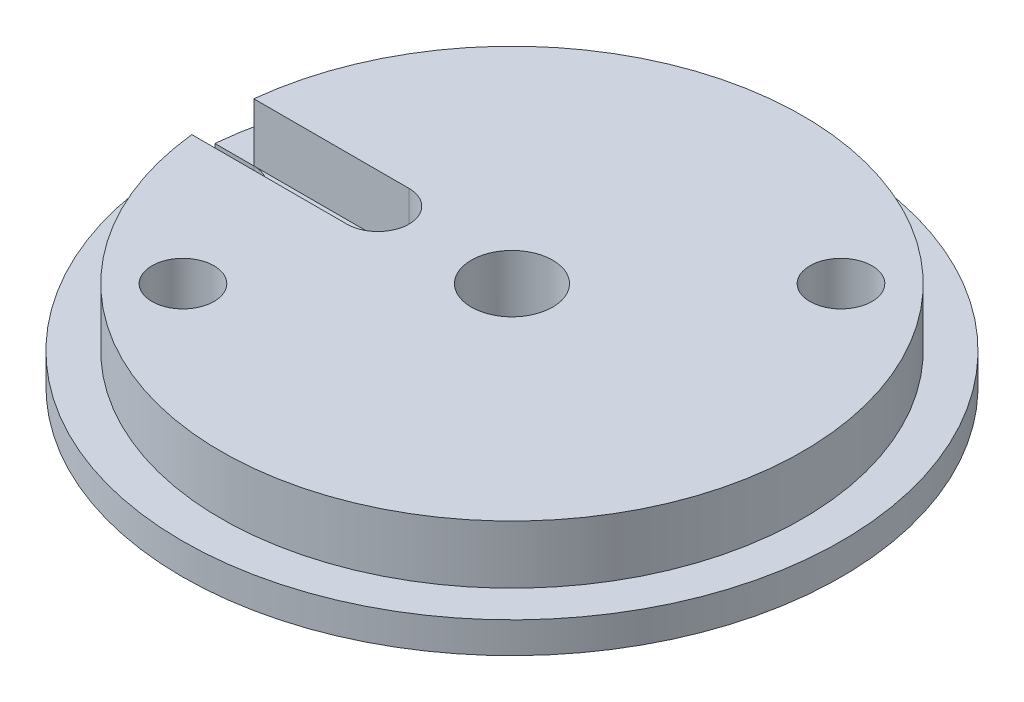
ISO-10303-21;
HEADER;
FILE_DESCRIPTION(('STEP AP214'),'2;1');
FILE_NAME('part.step','',(''),(''),'','','');
FILE_SCHEMA(('AUTOMOTIVE_DESIGN { 1 0 10303 214 1 1 1 1 }'));
ENDSEC;
DATA;
#1=APPLICATION_CONTEXT('core data for automotive mechanical design processes');
#2=APPLICATION_PROTOCOL_DEFINITION('international standard','automotive_design',2000,#1);
#3=PRODUCT_CONTEXT('',#1,'mechanical');
#4=PRODUCT('Part','Part','',(#3));
#5=PRODUCT_RELATED_PRODUCT_CATEGORY('part','',(#4));
#6=PRODUCT_DEFINITION_FORMATION('','',#4);
#7=PRODUCT_DEFINITION_CONTEXT('part definition',#1,'design');
#8=PRODUCT_DEFINITION('design','',#6,#7);
#9=PRODUCT_DEFINITION_SHAPE('','',#8);
#10=(LENGTH_UNIT() NAMED_UNIT(*) SI_UNIT(.MILLI.,.METRE.));
#11=(NAMED_UNIT(*) PLANE_ANGLE_UNIT() SI_UNIT($,.RADIAN.));
#12=(NAMED_UNIT(*) SI_UNIT($,.STERADIAN.) SOLID_ANGLE_UNIT());
#13=UNCERTAINTY_MEASURE_WITH_UNIT(LENGTH_MEASURE(1.E-05),#10,'distance_accuracy_value','');
#14=(GEOMETRIC_REPRESENTATION_CONTEXT(3) GLOBAL_UNCERTAINTY_ASSIGNED_CONTEXT((#13)) GLOBAL_UNIT_ASSIGNED_CONTEXT((#10,
#11,#12)) REPRESENTATION_CONTEXT('',''));
#15=CARTESIAN_POINT('',(0.,0.,0.));
#16=DIRECTION('',(0.,0.,1.));
#17=DIRECTION('',(1.,0.,0.));
#18=AXIS2_PLACEMENT_3D('',#15,#16,#17);
#19=CARTESIAN_POINT('',(0.,3.,0.));
#20=DIRECTION('',(0.,1.,0.));
#21=DIRECTION('',(0.,0.,-1.));
#22=AXIS2_PLACEMENT_3D('',#19,#20,#21);
#23=PLANE('',#22);
#24=CARTESIAN_POINT('',(-8.48528137423855,3.,8.48528137423859));
#25=DIRECTION('',(0.,1.,0.));
#26=DIRECTION('',(0.,0.,1.));
#27=AXIS2_PLACEMENT_3D('',#24,#25,#26);
#28=CIRCLE('',#27,1.6);
#29=CARTESIAN_POINT('',(-8.48528137423855,3.,10.0852813742386));
#30=VERTEX_POINT('',#29);
#31=EDGE_CURVE('E217',#30,#30,#28,.T.);
#32=ORIENTED_EDGE('',*,*,#31,.F.);
#33=EDGE_LOOP('',(#32));
#34=FACE_BOUND('',#33,.T.);
#35=CARTESIAN_POINT('',(8.48528137423856,3.,-8.48528137423859));
#36=DIRECTION('',(0.,1.,0.));
#37=DIRECTION('',(0.,0.,-1.));
#38=AXIS2_PLACEMENT_3D('',#35,#36,#37);
#39=CIRCLE('',#38,1.6);
#40=CARTESIAN_POINT('',(8.48528137423856,3.,-10.0852813742386));
#41=VERTEX_POINT('',#40);
#42=EDGE_CURVE('E345',#41,#41,#39,.T.);
#43=ORIENTED_EDGE('',*,*,#42,.F.);
#44=EDGE_LOOP('',(#43));
#45=FACE_BOUND('',#44,.T.);
#46=DIRECTION('',(-1.,0.,0.));
#47=VECTOR('',#46,1.);
#48=CARTESIAN_POINT('',(-14.9144225500017,3.,1.6));
#49=LINE('',#48,#47);
#50=CARTESIAN_POINT('',(-6.91442255000173,3.,1.6));
#51=VERTEX_POINT('',#50);
#52=CARTESIAN_POINT('',(-14.9144225500017,3.,1.6));
#53=VERTEX_POINT('',#52);
#54=EDGE_CURVE('E143',#51,#53,#49,.T.);
#55=ORIENTED_EDGE('',*,*,#54,.T.);
#56=CARTESIAN_POINT('',(0.,3.,0.));
#57=DIRECTION('',(0.,-1.,0.));
#58=DIRECTION('',(0.,0.,-1.));
#59=AXIS2_PLACEMENT_3D('',#56,#57,#58);
#60=CIRCLE('',#59,15.);
#61=CARTESIAN_POINT('',(-14.9144225500017,3.,-1.6));
#62=VERTEX_POINT('',#61);
#63=EDGE_CURVE('E159',#62,#53,#60,.T.);
#64=ORIENTED_EDGE('',*,*,#63,.F.);
#65=DIRECTION('',(1.,0.,0.));
#66=VECTOR('',#65,1.);
#67=CARTESIAN_POINT('',(-14.9144225500017,3.,-1.6));
#68=LINE('',#67,#66);
#69=CARTESIAN_POINT('',(-6.91442255000173,3.,-1.6));
#70=VERTEX_POINT('',#69);
#71=EDGE_CURVE('E104',#62,#70,#68,.T.);
#72=ORIENTED_EDGE('',*,*,#71,.T.);
#73=CARTESIAN_POINT('',(-6.91442255000173,3.,0.));
#74=DIRECTION('',(0.,-1.,0.));
#75=DIRECTION('',(0.,0.,1.));
#76=AXIS2_PLACEMENT_3D('',#73,#74,#75);
#77=CIRCLE('',#76,1.6);
#78=EDGE_CURVE('E140',#70,#51,#77,.T.);
#79=ORIENTED_EDGE('',*,*,#78,.T.);
#80=EDGE_LOOP('',(#55,#64,#72,#79));
#81=FACE_BOUND('',#80,.T.);
#82=CARTESIAN_POINT('',(0.,3.,0.));
#83=DIRECTION('',(0.,-1.,0.));
#84=DIRECTION('',(0.,0.,-1.));
#85=AXIS2_PLACEMENT_3D('',#82,#83,#84);
#86=CIRCLE('',#85,2.1);
#87=CARTESIAN_POINT('',(0.,3.,-2.1));
#88=VERTEX_POINT('',#87);
#89=EDGE_CURVE('E155',#88,#88,#86,.T.);
#90=ORIENTED_EDGE('',*,*,#89,.T.);
#91=EDGE_LOOP('',(#90));
#92=FACE_BOUND('',#91,.T.);
#93=ADVANCED_FACE('F37',(#34,#45,#81,#92),#23,.T.);
#94=CARTESIAN_POINT('',(0.,3.,0.));
#95=DIRECTION('',(0.,-1.,0.));
#96=DIRECTION('',(0.,0.,1.));
#97=AXIS2_PLACEMENT_3D('',#94,#95,#96);
#98=CYLINDRICAL_SURFACE('',#97,15.);
#99=CARTESIAN_POINT('',(0.,0.,0.));
#100=DIRECTION('',(0.,-1.,0.));
#101=DIRECTION('',(0.,0.,-1.));
#102=AXIS2_PLACEMENT_3D('',#99,#100,#101);
#103=CIRCLE('',#102,15.);
#104=CARTESIAN_POINT('',(-14.9144225500017,0.,-1.6));
#105=VERTEX_POINT('',#104);
#106=CARTESIAN_POINT('',(-14.9144225500017,0.,1.6));
#107=VERTEX_POINT('',#106);
#108=EDGE_CURVE('E158',#105,#107,#103,.T.);
#109=ORIENTED_EDGE('',*,*,#108,.F.);
#110=DIRECTION('',(0.,-1.,0.));
#111=VECTOR('',#110,1.);
#112=CARTESIAN_POINT('',(-14.9144225500017,3.,-1.6));
#113=LINE('',#112,#111);
#114=EDGE_CURVE('E45',#62,#105,#113,.T.);
#115=ORIENTED_EDGE('',*,*,#114,.F.);
#116=ORIENTED_EDGE('',*,*,#63,.T.);
#117=DIRECTION('',(0.,-1.,0.));
#118=VECTOR('',#117,1.);
#119=CARTESIAN_POINT('',(-14.9144225500017,3.,1.6));
#120=LINE('',#119,#118);
#121=EDGE_CURVE('E11',#107,#53,#120,.F.);
#122=ORIENTED_EDGE('',*,*,#121,.F.);
#123=EDGE_LOOP('',(#109,#115,#116,#122));
#124=FACE_BOUND('',#123,.T.);
#125=ADVANCED_FACE('F39',(#124),#98,.T.);
#126=CARTESIAN_POINT('',(0.,3.,0.));
#127=DIRECTION('',(0.,-1.,0.));
#128=DIRECTION('',(0.,0.,1.));
#129=AXIS2_PLACEMENT_3D('',#126,#127,#128);
#130=CYLINDRICAL_SURFACE('',#129,2.1);
#131=ORIENTED_EDGE('',*,*,#89,.F.);
#132=EDGE_LOOP('',(#131));
#133=FACE_BOUND('',#132,.T.);
#134=CARTESIAN_POINT('',(0.,-1.6,0.));
#135=DIRECTION('',(0.,1.,0.));
#136=DIRECTION('',(0.,0.,1.));
#137=AXIS2_PLACEMENT_3D('',#134,#135,#136);
#138=CIRCLE('',#137,2.1);
#139=CARTESIAN_POINT('',(0.,-1.6,2.1));
#140=VERTEX_POINT('',#139);
#141=EDGE_CURVE('E182',#140,#140,#138,.T.);
#142=ORIENTED_EDGE('',*,*,#141,.F.);
#143=EDGE_LOOP('',(#142));
#144=FACE_BOUND('',#143,.T.);
#145=ADVANCED_FACE('F198',(#133,#144),#130,.F.);
#146=CARTESIAN_POINT('',(-6.91442255000173,-7.,0.));
#147=DIRECTION('',(0.,1.,0.));
#148=DIRECTION('',(0.,0.,-1.));
#149=AXIS2_PLACEMENT_3D('',#146,#147,#148);
#150=CYLINDRICAL_SURFACE('',#149,1.6);
#151=DIRECTION('',(0.,1.,0.));
#152=VECTOR('',#151,1.);
#153=CARTESIAN_POINT('',(-6.91442255000173,-7.,-1.6));
#154=LINE('',#153,#152);
#155=CARTESIAN_POINT('',(-6.91442255000173,0.,-1.6));
#156=VERTEX_POINT('',#155);
#157=EDGE_CURVE('E146',#156,#70,#154,.T.);
#158=ORIENTED_EDGE('',*,*,#157,.F.);
#159=CARTESIAN_POINT('',(-6.91442255000173,0.,0.));
#160=DIRECTION('',(0.,1.,0.));
#161=DIRECTION('',(0.,0.,1.));
#162=AXIS2_PLACEMENT_3D('',#159,#160,#161);
#163=CIRCLE('',#162,1.6);
#164=CARTESIAN_POINT('',(-6.91442255000173,0.,1.6));
#165=VERTEX_POINT('',#164);
#166=EDGE_CURVE('E123',#156,#165,#163,.T.);
#167=ORIENTED_EDGE('',*,*,#166,.T.);
#168=DIRECTION('',(0.,1.,0.));
#169=VECTOR('',#168,1.);
#170=CARTESIAN_POINT('',(-6.91442255000173,-7.,1.6));
#171=LINE('',#170,#169);
#172=EDGE_CURVE('E147',#165,#51,#171,.T.);
#173=ORIENTED_EDGE('',*,*,#172,.T.);
#174=ORIENTED_EDGE('',*,*,#78,.F.);
#175=EDGE_LOOP('',(#158,#167,#173,#174));
#176=FACE_BOUND('',#175,.T.);
#177=CARTESIAN_POINT('',(-6.91442255000173,-1.6,0.));
#178=DIRECTION('',(0.,1.,0.));
#179=DIRECTION('',(0.,0.,1.));
#180=AXIS2_PLACEMENT_3D('',#177,#178,#179);
#181=CIRCLE('',#180,1.6);
#182=CARTESIAN_POINT('',(-6.91442255000173,-1.6,1.6));
#183=VERTEX_POINT('',#182);
#184=EDGE_CURVE('E131',#183,#183,#181,.T.);
#185=ORIENTED_EDGE('',*,*,#184,.F.);
#186=EDGE_LOOP('',(#185));
#187=FACE_BOUND('',#186,.T.);
#188=ADVANCED_FACE('F184',(#176,#187),#150,.F.);
#189=CARTESIAN_POINT('',(-14.9144225500017,-7.,1.6));
#190=DIRECTION('',(0.,0.,1.));
#191=DIRECTION('',(-1.,0.,0.));
#192=AXIS2_PLACEMENT_3D('',#189,#190,#191);
#193=PLANE('',#192);
#194=ORIENTED_EDGE('',*,*,#172,.F.);
#195=DIRECTION('',(-1.,0.,0.));
#196=VECTOR('',#195,1.);
#197=CARTESIAN_POINT('',(0.,0.,1.6));
#198=LINE('',#197,#196);
#199=EDGE_CURVE('E152',#165,#107,#198,.T.);
#200=ORIENTED_EDGE('',*,*,#199,.T.);
#201=ORIENTED_EDGE('',*,*,#121,.T.);
#202=ORIENTED_EDGE('',*,*,#54,.F.);
#203=EDGE_LOOP('',(#194,#200,#201,#202));
#204=FACE_BOUND('',#203,.T.);
#205=ADVANCED_FACE('F190',(#204),#193,.F.);
#206=CARTESIAN_POINT('',(-14.9144225500017,-7.,-1.6));
#207=DIRECTION('',(0.,0.,-1.));
#208=DIRECTION('',(1.,0.,0.));
#209=AXIS2_PLACEMENT_3D('',#206,#207,#208);
#210=PLANE('',#209);
#211=ORIENTED_EDGE('',*,*,#114,.T.);
#212=DIRECTION('',(1.,0.,0.));
#213=VECTOR('',#212,1.);
#214=CARTESIAN_POINT('',(0.,0.,-1.6));
#215=LINE('',#214,#213);
#216=EDGE_CURVE('E149',#105,#156,#215,.T.);
#217=ORIENTED_EDGE('',*,*,#216,.T.);
#218=ORIENTED_EDGE('',*,*,#157,.T.);
#219=ORIENTED_EDGE('',*,*,#71,.F.);
#220=EDGE_LOOP('',(#211,#217,#218,#219));
#221=FACE_BOUND('',#220,.T.);
#222=ADVANCED_FACE('F167',(#221),#210,.F.);
#223=CARTESIAN_POINT('',(0.,0.,0.));
#224=DIRECTION('',(0.,-1.,0.));
#225=DIRECTION('',(0.,0.,1.));
#226=AXIS2_PLACEMENT_3D('',#223,#224,#225);
#227=PLANE('',#226);
#228=ORIENTED_EDGE('',*,*,#166,.F.);
#229=ORIENTED_EDGE('',*,*,#216,.F.);
#230=CARTESIAN_POINT('',(-14.9144225500017,0.,0.));
#231=DIRECTION('',(0.,-1.,0.));
#232=DIRECTION('',(0.,0.,-1.));
#233=AXIS2_PLACEMENT_3D('',#230,#231,#232);
#234=CIRCLE('',#233,1.6);
#235=EDGE_CURVE('E120',#105,#107,#234,.T.);
#236=ORIENTED_EDGE('',*,*,#235,.T.);
#237=ORIENTED_EDGE('',*,*,#199,.F.);
#238=EDGE_LOOP('',(#228,#229,#236,#237));
#239=FACE_BOUND('',#238,.T.);
#240=ADVANCED_FACE('F177',(#239),#227,.F.);
#241=CARTESIAN_POINT('',(0.,-1.6,0.));
#242=DIRECTION('',(0.,-1.,0.));
#243=DIRECTION('',(0.,0.,1.));
#244=AXIS2_PLACEMENT_3D('',#241,#242,#243);
#245=PLANE('',#244);
#246=CARTESIAN_POINT('',(-8.48528137423855,-1.6,8.48528137423859));
#247=DIRECTION('',(0.,1.,0.));
#248=DIRECTION('',(0.,0.,1.));
#249=AXIS2_PLACEMENT_3D('',#246,#247,#248);
#250=CIRCLE('',#249,1.6);
#251=CARTESIAN_POINT('',(-8.48528137423855,-1.6,10.0852813742386));
#252=VERTEX_POINT('',#251);
#253=EDGE_CURVE('E220',#252,#252,#250,.T.);
#254=ORIENTED_EDGE('',*,*,#253,.T.);
#255=EDGE_LOOP('',(#254));
#256=FACE_BOUND('',#255,.T.);
#257=CARTESIAN_POINT('',(8.48528137423856,-1.6,-8.48528137423859));
#258=DIRECTION('',(0.,1.,0.));
#259=DIRECTION('',(0.,0.,-1.));
#260=AXIS2_PLACEMENT_3D('',#257,#258,#259);
#261=CIRCLE('',#260,1.6);
#262=CARTESIAN_POINT('',(8.48528137423856,-1.6,-10.0852813742386));
#263=VERTEX_POINT('',#262);
#264=EDGE_CURVE('E223',#263,#263,#261,.T.);
#265=ORIENTED_EDGE('',*,*,#264,.T.);
#266=EDGE_LOOP('',(#265));
#267=FACE_BOUND('',#266,.T.);
#268=ORIENTED_EDGE('',*,*,#184,.T.);
#269=EDGE_LOOP('',(#268));
#270=FACE_BOUND('',#269,.T.);
#271=CARTESIAN_POINT('',(0.,-1.6,0.));
#272=DIRECTION('',(0.,1.,0.));
#273=DIRECTION('',(0.,0.,1.));
#274=AXIS2_PLACEMENT_3D('',#271,#272,#273);
#275=CIRCLE('',#274,17.);
#276=CARTESIAN_POINT('',(-16.924538398432,-1.6,1.6));
#277=VERTEX_POINT('',#276);
#278=CARTESIAN_POINT('',(-16.924538398432,-1.6,-1.6));
#279=VERTEX_POINT('',#278);
#280=EDGE_CURVE('E111',#277,#279,#275,.T.);
#281=ORIENTED_EDGE('',*,*,#280,.F.);
#282=DIRECTION('',(-1.,0.,0.));
#283=VECTOR('',#282,1.);
#284=CARTESIAN_POINT('',(-16.924538398432,-1.6,1.6));
#285=LINE('',#284,#283);
#286=CARTESIAN_POINT('',(-14.9144225500017,-1.6,1.6));
#287=VERTEX_POINT('',#286);
#288=EDGE_CURVE('E127',#287,#277,#285,.T.);
#289=ORIENTED_EDGE('',*,*,#288,.F.);
#290=CARTESIAN_POINT('',(-14.9144225500017,-1.6,0.));
#291=DIRECTION('',(0.,-1.,0.));
#292=DIRECTION('',(0.,0.,-1.));
#293=AXIS2_PLACEMENT_3D('',#290,#291,#292);
#294=CIRCLE('',#293,1.6);
#295=CARTESIAN_POINT('',(-14.9144225500017,-1.6,-1.6));
#296=VERTEX_POINT('',#295);
#297=EDGE_CURVE('E112',#296,#287,#294,.T.);
#298=ORIENTED_EDGE('',*,*,#297,.F.);
#299=DIRECTION('',(1.,0.,0.));
#300=VECTOR('',#299,1.);
#301=CARTESIAN_POINT('',(-14.9144225500017,-1.6,-1.6));
#302=LINE('',#301,#300);
#303=EDGE_CURVE('E97',#279,#296,#302,.T.);
#304=ORIENTED_EDGE('',*,*,#303,.F.);
#305=EDGE_LOOP('',(#281,#289,#298,#304));
#306=FACE_BOUND('',#305,.T.);
#307=ORIENTED_EDGE('',*,*,#141,.T.);
#308=EDGE_LOOP('',(#307));
#309=FACE_BOUND('',#308,.T.);
#310=ADVANCED_FACE('F108',(#256,#267,#270,#306,#309),#245,.T.);
#311=ORIENTED_EDGE('',*,*,#108,.T.);
#312=DIRECTION('',(-1.,0.,0.));
#313=VECTOR('',#312,1.);
#314=CARTESIAN_POINT('',(-16.924538398432,0.,1.6));
#315=LINE('',#314,#313);
#316=CARTESIAN_POINT('',(-16.924538398432,0.,1.6));
#317=VERTEX_POINT('',#316);
#318=EDGE_CURVE('E117',#107,#317,#315,.T.);
#319=ORIENTED_EDGE('',*,*,#318,.T.);
#320=CARTESIAN_POINT('',(0.,0.,0.));
#321=DIRECTION('',(0.,1.,0.));
#322=DIRECTION('',(0.,0.,1.));
#323=AXIS2_PLACEMENT_3D('',#320,#321,#322);
#324=CIRCLE('',#323,17.);
#325=CARTESIAN_POINT('',(-16.924538398432,0.,-1.6));
#326=VERTEX_POINT('',#325);
#327=EDGE_CURVE('E129',#317,#326,#324,.T.);
#328=ORIENTED_EDGE('',*,*,#327,.T.);
#329=DIRECTION('',(1.,0.,0.));
#330=VECTOR('',#329,1.);
#331=CARTESIAN_POINT('',(-14.9144225500017,0.,-1.6));
#332=LINE('',#331,#330);
#333=EDGE_CURVE('E99',#326,#105,#332,.T.);
#334=ORIENTED_EDGE('',*,*,#333,.T.);
#335=EDGE_LOOP('',(#311,#319,#328,#334));
#336=FACE_BOUND('',#335,.T.);
#337=ADVANCED_FACE('F174',(#336),#227,.F.);
#338=CARTESIAN_POINT('',(0.,-1.6,0.));
#339=DIRECTION('',(0.,1.,0.));
#340=DIRECTION('',(0.,0.,-1.));
#341=AXIS2_PLACEMENT_3D('',#338,#339,#340);
#342=CYLINDRICAL_SURFACE('',#341,17.);
#343=ORIENTED_EDGE('',*,*,#327,.F.);
#344=DIRECTION('',(0.,1.,0.));
#345=VECTOR('',#344,1.);
#346=CARTESIAN_POINT('',(-16.924538398432,-1.6,1.6));
#347=LINE('',#346,#345);
#348=EDGE_CURVE('E115',#277,#317,#347,.T.);
#349=ORIENTED_EDGE('',*,*,#348,.F.);
#350=ORIENTED_EDGE('',*,*,#280,.T.);
#351=DIRECTION('',(0.,1.,0.));
#352=VECTOR('',#351,1.);
#353=CARTESIAN_POINT('',(-16.924538398432,-1.6,-1.6));
#354=LINE('',#353,#352);
#355=EDGE_CURVE('E94',#279,#326,#354,.T.);
#356=ORIENTED_EDGE('',*,*,#355,.T.);
#357=EDGE_LOOP('',(#343,#349,#350,#356));
#358=FACE_BOUND('',#357,.T.);
#359=ADVANCED_FACE('F114',(#358),#342,.T.);
#360=CARTESIAN_POINT('',(-14.9144225500017,-1.6,-1.6));
#361=DIRECTION('',(0.,0.,-1.));
#362=DIRECTION('',(1.,0.,0.));
#363=AXIS2_PLACEMENT_3D('',#360,#361,#362);
#364=PLANE('',#363);
#365=ORIENTED_EDGE('',*,*,#333,.F.);
#366=ORIENTED_EDGE('',*,*,#355,.F.);
#367=ORIENTED_EDGE('',*,*,#303,.T.);
#368=DIRECTION('',(0.,1.,0.));
#369=VECTOR('',#368,1.);
#370=CARTESIAN_POINT('',(-14.9144225500017,-1.6,-1.6));
#371=LINE('',#370,#369);
#372=EDGE_CURVE('E52',#296,#105,#371,.T.);
#373=ORIENTED_EDGE('',*,*,#372,.T.);
#374=EDGE_LOOP('',(#365,#366,#367,#373));
#375=FACE_BOUND('',#374,.T.);
#376=ADVANCED_FACE('F96',(#375),#364,.F.);
#377=CARTESIAN_POINT('',(-14.9144225500017,-1.6,0.));
#378=DIRECTION('',(0.,1.,0.));
#379=DIRECTION('',(0.,0.,-1.));
#380=AXIS2_PLACEMENT_3D('',#377,#378,#379);
#381=CYLINDRICAL_SURFACE('',#380,1.6);
#382=ORIENTED_EDGE('',*,*,#235,.F.);
#383=ORIENTED_EDGE('',*,*,#372,.F.);
#384=ORIENTED_EDGE('',*,*,#297,.T.);
#385=DIRECTION('',(0.,1.,0.));
#386=VECTOR('',#385,1.);
#387=CARTESIAN_POINT('',(-14.9144225500017,-1.6,1.6));
#388=LINE('',#387,#386);
#389=EDGE_CURVE('E60',#287,#107,#388,.T.);
#390=ORIENTED_EDGE('',*,*,#389,.T.);
#391=EDGE_LOOP('',(#382,#383,#384,#390));
#392=FACE_BOUND('',#391,.T.);
#393=ADVANCED_FACE('F175',(#392),#381,.F.);
#394=CARTESIAN_POINT('',(-16.924538398432,-1.6,1.6));
#395=DIRECTION('',(0.,0.,1.));
#396=DIRECTION('',(-1.,0.,0.));
#397=AXIS2_PLACEMENT_3D('',#394,#395,#396);
#398=PLANE('',#397);
#399=ORIENTED_EDGE('',*,*,#318,.F.);
#400=ORIENTED_EDGE('',*,*,#389,.F.);
#401=ORIENTED_EDGE('',*,*,#288,.T.);
#402=ORIENTED_EDGE('',*,*,#348,.T.);
#403=EDGE_LOOP('',(#399,#400,#401,#402));
#404=FACE_BOUND('',#403,.T.);
#405=ADVANCED_FACE('F242',(#404),#398,.F.);
#406=CARTESIAN_POINT('',(8.48528137423856,3.,-8.48528137423859));
#407=DIRECTION('',(0.,-1.,0.));
#408=DIRECTION('',(0.,0.,1.));
#409=AXIS2_PLACEMENT_3D('',#406,#407,#408);
#410=CYLINDRICAL_SURFACE('',#409,1.6);
#411=ORIENTED_EDGE('',*,*,#42,.T.);
#412=EDGE_LOOP('',(#411));
#413=FACE_BOUND('',#412,.T.);
#414=ORIENTED_EDGE('',*,*,#264,.F.);
#415=EDGE_LOOP('',(#414));
#416=FACE_BOUND('',#415,.T.);
#417=ADVANCED_FACE('F239',(#413,#416),#410,.F.);
#418=CARTESIAN_POINT('',(-8.48528137423855,3.,8.48528137423859));
#419=DIRECTION('',(0.,-1.,0.));
#420=DIRECTION('',(0.,0.,1.));
#421=AXIS2_PLACEMENT_3D('',#418,#419,#420);
#422=CYLINDRICAL_SURFACE('',#421,1.6);
#423=ORIENTED_EDGE('',*,*,#31,.T.);
#424=EDGE_LOOP('',(#423));
#425=FACE_BOUND('',#424,.T.);
#426=ORIENTED_EDGE('',*,*,#253,.F.);
#427=EDGE_LOOP('',(#426));
#428=FACE_BOUND('',#427,.T.);
#429=ADVANCED_FACE('F272',(#425,#428),#422,.F.);
#430=CLOSED_SHELL('',(#93,#125,#145,#188,#205,#222,#240,#310,#337,#359,#376,#393,#405,#417,#429));
#431=MANIFOLD_SOLID_BREP('B2',#430);
#432=ADVANCED_BREP_SHAPE_REPRESENTATION('',(#18,#431),#14);
#433=SHAPE_DEFINITION_REPRESENTATION(#9,#432);
ENDSEC;
END-ISO-10303-21;
